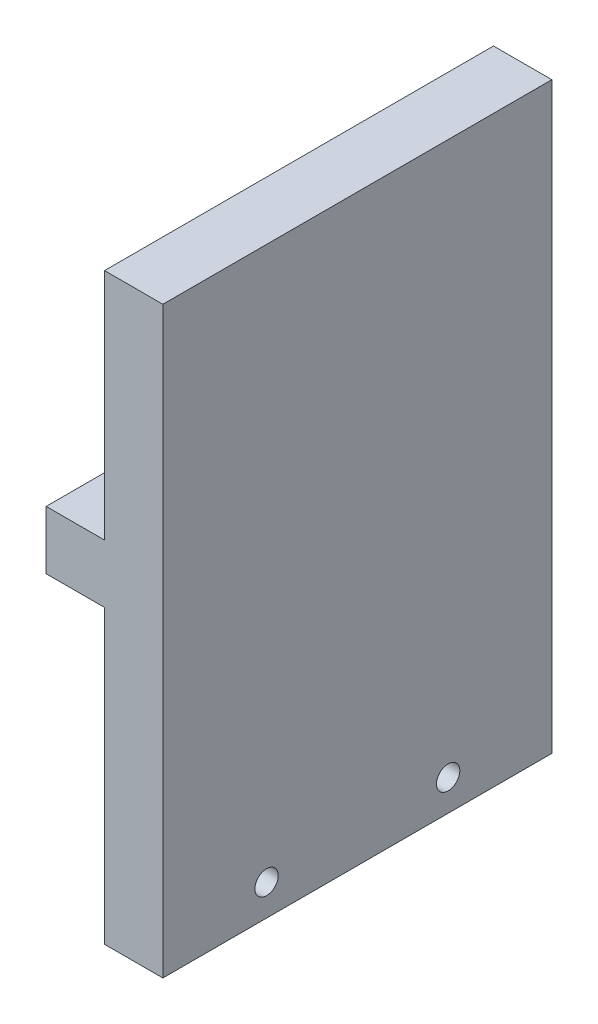
ISO-10303-21;
HEADER;
FILE_DESCRIPTION(('STEP AP214'),'2;1');
FILE_NAME('part.step','',(''),(''),'','','');
FILE_SCHEMA(('AUTOMOTIVE_DESIGN { 1 0 10303 214 1 1 1 1 }'));
ENDSEC;
DATA;
#1=APPLICATION_CONTEXT('core data for automotive mechanical design processes');
#2=APPLICATION_PROTOCOL_DEFINITION('international standard','automotive_design',2000,#1);
#3=PRODUCT_CONTEXT('',#1,'mechanical');
#4=PRODUCT('Part','Part','',(#3));
#5=PRODUCT_RELATED_PRODUCT_CATEGORY('part','',(#4));
#6=PRODUCT_DEFINITION_FORMATION('','',#4);
#7=PRODUCT_DEFINITION_CONTEXT('part definition',#1,'design');
#8=PRODUCT_DEFINITION('design','',#6,#7);
#9=PRODUCT_DEFINITION_SHAPE('','',#8);
#10=(LENGTH_UNIT() NAMED_UNIT(*) SI_UNIT(.MILLI.,.METRE.));
#11=(NAMED_UNIT(*) PLANE_ANGLE_UNIT() SI_UNIT($,.RADIAN.));
#12=(NAMED_UNIT(*) SI_UNIT($,.STERADIAN.) SOLID_ANGLE_UNIT());
#13=UNCERTAINTY_MEASURE_WITH_UNIT(LENGTH_MEASURE(1.E-05),#10,'distance_accuracy_value','');
#14=(GEOMETRIC_REPRESENTATION_CONTEXT(3) GLOBAL_UNCERTAINTY_ASSIGNED_CONTEXT((#13)) GLOBAL_UNIT_ASSIGNED_CONTEXT((#10,
#11,#12)) REPRESENTATION_CONTEXT('',''));
#15=CARTESIAN_POINT('',(0.,0.,0.));
#16=DIRECTION('',(0.,0.,1.));
#17=DIRECTION('',(1.,0.,0.));
#18=AXIS2_PLACEMENT_3D('',#15,#16,#17);
#19=CARTESIAN_POINT('',(0.,0.,0.));
#20=DIRECTION('',(-1.,0.,0.));
#21=DIRECTION('',(0.,0.,1.));
#22=AXIS2_PLACEMENT_3D('',#19,#20,#21);
#23=PLANE('',#22);
#24=CARTESIAN_POINT('',(0.,-67.,-23.345));
#25=DIRECTION('',(-1.,0.,0.));
#26=DIRECTION('',(0.,0.,1.));
#27=AXIS2_PLACEMENT_3D('',#24,#25,#26);
#28=CIRCLE('',#27,3.);
#29=CARTESIAN_POINT('',(0.,-67.,-20.345));
#30=VERTEX_POINT('',#29);
#31=EDGE_CURVE('E245',#30,#30,#28,.T.);
#32=ORIENTED_EDGE('',*,*,#31,.F.);
#33=EDGE_LOOP('',(#32));
#34=FACE_BOUND('',#33,.T.);
#35=CARTESIAN_POINT('',(0.,-67.,23.345));
#36=DIRECTION('',(-1.,0.,0.));
#37=DIRECTION('',(0.,0.,1.));
#38=AXIS2_PLACEMENT_3D('',#35,#36,#37);
#39=CIRCLE('',#38,3.);
#40=CARTESIAN_POINT('',(0.,-67.,26.345));
#41=VERTEX_POINT('',#40);
#42=EDGE_CURVE('E230',#41,#41,#39,.T.);
#43=ORIENTED_EDGE('',*,*,#42,.F.);
#44=EDGE_LOOP('',(#43));
#45=FACE_BOUND('',#44,.T.);
#46=DIRECTION('',(0.,1.,0.));
#47=VECTOR('',#46,1.);
#48=CARTESIAN_POINT('',(0.,0.,-15.));
#49=LINE('',#48,#47);
#50=CARTESIAN_POINT('',(0.,-15.,-15.));
#51=VERTEX_POINT('',#50);
#52=CARTESIAN_POINT('',(0.,0.,-15.));
#53=VERTEX_POINT('',#52);
#54=EDGE_CURVE('E229',#51,#53,#49,.T.);
#55=ORIENTED_EDGE('',*,*,#54,.F.);
#56=DIRECTION('',(0.,0.,1.));
#57=VECTOR('',#56,1.);
#58=CARTESIAN_POINT('',(0.,-15.,-50.));
#59=LINE('',#58,#57);
#60=CARTESIAN_POINT('',(0.,-15.,-50.));
#61=VERTEX_POINT('',#60);
#62=EDGE_CURVE('E227',#61,#51,#59,.T.);
#63=ORIENTED_EDGE('',*,*,#62,.F.);
#64=DIRECTION('',(0.,1.,0.));
#65=VECTOR('',#64,1.);
#66=CARTESIAN_POINT('',(0.,-75.,-50.));
#67=LINE('',#66,#65);
#68=CARTESIAN_POINT('',(0.,-75.,-50.));
#69=VERTEX_POINT('',#68);
#70=EDGE_CURVE('E147',#69,#61,#67,.T.);
#71=ORIENTED_EDGE('',*,*,#70,.F.);
#72=DIRECTION('',(0.,0.,-1.));
#73=VECTOR('',#72,1.);
#74=CARTESIAN_POINT('',(0.,-75.,50.));
#75=LINE('',#74,#73);
#76=CARTESIAN_POINT('',(0.,-75.,50.));
#77=VERTEX_POINT('',#76);
#78=EDGE_CURVE('E196',#77,#69,#75,.T.);
#79=ORIENTED_EDGE('',*,*,#78,.F.);
#80=DIRECTION('',(0.,-1.,0.));
#81=VECTOR('',#80,1.);
#82=CARTESIAN_POINT('',(0.,-75.,50.));
#83=LINE('',#82,#81);
#84=CARTESIAN_POINT('',(0.,0.,50.));
#85=VERTEX_POINT('',#84);
#86=EDGE_CURVE('E206',#85,#77,#83,.T.);
#87=ORIENTED_EDGE('',*,*,#86,.F.);
#88=DIRECTION('',(0.,0.,1.));
#89=VECTOR('',#88,1.);
#90=CARTESIAN_POINT('',(0.,0.,50.));
#91=LINE('',#90,#89);
#92=CARTESIAN_POINT('',(0.,0.,15.));
#93=VERTEX_POINT('',#92);
#94=EDGE_CURVE('E57',#93,#85,#91,.T.);
#95=ORIENTED_EDGE('',*,*,#94,.F.);
#96=DIRECTION('',(0.,-1.,0.));
#97=VECTOR('',#96,1.);
#98=CARTESIAN_POINT('',(0.,0.,15.));
#99=LINE('',#98,#97);
#100=CARTESIAN_POINT('',(0.,15.,15.));
#101=VERTEX_POINT('',#100);
#102=EDGE_CURVE('E151',#101,#93,#99,.T.);
#103=ORIENTED_EDGE('',*,*,#102,.F.);
#104=DIRECTION('',(0.,0.,-1.));
#105=VECTOR('',#104,1.);
#106=CARTESIAN_POINT('',(0.,15.,50.));
#107=LINE('',#106,#105);
#108=CARTESIAN_POINT('',(0.,15.,50.));
#109=VERTEX_POINT('',#108);
#110=EDGE_CURVE('E148',#109,#101,#107,.T.);
#111=ORIENTED_EDGE('',*,*,#110,.F.);
#112=CARTESIAN_POINT('',(0.,75.,50.));
#113=VERTEX_POINT('',#112);
#114=EDGE_CURVE('E213',#113,#109,#83,.T.);
#115=ORIENTED_EDGE('',*,*,#114,.F.);
#116=DIRECTION('',(0.,0.,1.));
#117=VECTOR('',#116,1.);
#118=CARTESIAN_POINT('',(0.,75.,50.));
#119=LINE('',#118,#117);
#120=CARTESIAN_POINT('',(0.,75.,-50.));
#121=VERTEX_POINT('',#120);
#122=EDGE_CURVE('E204',#121,#113,#119,.T.);
#123=ORIENTED_EDGE('',*,*,#122,.F.);
#124=CARTESIAN_POINT('',(0.,0.,-50.));
#125=VERTEX_POINT('',#124);
#126=EDGE_CURVE('E190',#125,#121,#67,.T.);
#127=ORIENTED_EDGE('',*,*,#126,.F.);
#128=DIRECTION('',(0.,0.,-1.));
#129=VECTOR('',#128,1.);
#130=CARTESIAN_POINT('',(0.,0.,-50.));
#131=LINE('',#130,#129);
#132=EDGE_CURVE('E142',#53,#125,#131,.T.);
#133=ORIENTED_EDGE('',*,*,#132,.F.);
#134=EDGE_LOOP('',(#55,#63,#71,#79,#87,#95,#103,#111,#115,#123,#127,#133));
#135=FACE_BOUND('',#134,.T.);
#136=ADVANCED_FACE('F32',(#34,#45,#135),#23,.T.);
#137=CARTESIAN_POINT('',(15.,-75.,-50.));
#138=DIRECTION('',(0.,0.,1.));
#139=DIRECTION('',(1.,0.,0.));
#140=AXIS2_PLACEMENT_3D('',#137,#138,#139);
#141=PLANE('',#140);
#142=ORIENTED_EDGE('',*,*,#70,.T.);
#143=DIRECTION('',(1.,0.,0.));
#144=VECTOR('',#143,1.);
#145=CARTESIAN_POINT('',(-15.,-15.,-50.));
#146=LINE('',#145,#144);
#147=CARTESIAN_POINT('',(-15.,-15.,-50.));
#148=VERTEX_POINT('',#147);
#149=EDGE_CURVE('E127',#148,#61,#146,.T.);
#150=ORIENTED_EDGE('',*,*,#149,.F.);
#151=DIRECTION('',(0.,-1.,0.));
#152=VECTOR('',#151,1.);
#153=CARTESIAN_POINT('',(-15.,0.,-50.));
#154=LINE('',#153,#152);
#155=CARTESIAN_POINT('',(-15.,0.,-50.));
#156=VERTEX_POINT('',#155);
#157=EDGE_CURVE('E134',#156,#148,#154,.T.);
#158=ORIENTED_EDGE('',*,*,#157,.F.);
#159=DIRECTION('',(1.,0.,0.));
#160=VECTOR('',#159,1.);
#161=CARTESIAN_POINT('',(-15.,0.,-50.));
#162=LINE('',#161,#160);
#163=EDGE_CURVE('E240',#156,#125,#162,.T.);
#164=ORIENTED_EDGE('',*,*,#163,.T.);
#165=ORIENTED_EDGE('',*,*,#126,.T.);
#166=DIRECTION('',(-1.,0.,0.));
#167=VECTOR('',#166,1.);
#168=CARTESIAN_POINT('',(15.,75.,-50.));
#169=LINE('',#168,#167);
#170=CARTESIAN_POINT('',(15.,75.,-50.));
#171=VERTEX_POINT('',#170);
#172=EDGE_CURVE('E11',#171,#121,#169,.T.);
#173=ORIENTED_EDGE('',*,*,#172,.F.);
#174=DIRECTION('',(0.,1.,0.));
#175=VECTOR('',#174,1.);
#176=CARTESIAN_POINT('',(15.,-75.,-50.));
#177=LINE('',#176,#175);
#178=CARTESIAN_POINT('',(15.,-75.,-50.));
#179=VERTEX_POINT('',#178);
#180=EDGE_CURVE('E192',#179,#171,#177,.T.);
#181=ORIENTED_EDGE('',*,*,#180,.F.);
#182=DIRECTION('',(-1.,0.,0.));
#183=VECTOR('',#182,1.);
#184=CARTESIAN_POINT('',(15.,-75.,-50.));
#185=LINE('',#184,#183);
#186=EDGE_CURVE('E202',#179,#69,#185,.T.);
#187=ORIENTED_EDGE('',*,*,#186,.T.);
#188=EDGE_LOOP('',(#142,#150,#158,#164,#165,#173,#181,#187));
#189=FACE_BOUND('',#188,.T.);
#190=ADVANCED_FACE('F34',(#189),#141,.F.);
#191=CARTESIAN_POINT('',(15.,75.,50.));
#192=DIRECTION('',(0.,-1.,0.));
#193=DIRECTION('',(0.,0.,-1.));
#194=AXIS2_PLACEMENT_3D('',#191,#192,#193);
#195=PLANE('',#194);
#196=ORIENTED_EDGE('',*,*,#122,.T.);
#197=DIRECTION('',(-1.,0.,0.));
#198=VECTOR('',#197,1.);
#199=CARTESIAN_POINT('',(15.,75.,50.));
#200=LINE('',#199,#198);
#201=CARTESIAN_POINT('',(15.,75.,50.));
#202=VERTEX_POINT('',#201);
#203=EDGE_CURVE('E41',#202,#113,#200,.T.);
#204=ORIENTED_EDGE('',*,*,#203,.F.);
#205=DIRECTION('',(0.,0.,1.));
#206=VECTOR('',#205,1.);
#207=CARTESIAN_POINT('',(15.,75.,50.));
#208=LINE('',#207,#206);
#209=EDGE_CURVE('E195',#171,#202,#208,.T.);
#210=ORIENTED_EDGE('',*,*,#209,.F.);
#211=ORIENTED_EDGE('',*,*,#172,.T.);
#212=EDGE_LOOP('',(#196,#204,#210,#211));
#213=FACE_BOUND('',#212,.T.);
#214=ADVANCED_FACE('F265',(#213),#195,.F.);
#215=CARTESIAN_POINT('',(15.,-75.,50.));
#216=DIRECTION('',(0.,0.,-1.));
#217=DIRECTION('',(-1.,0.,0.));
#218=AXIS2_PLACEMENT_3D('',#215,#216,#217);
#219=PLANE('',#218);
#220=ORIENTED_EDGE('',*,*,#114,.T.);
#221=DIRECTION('',(1.,0.,0.));
#222=VECTOR('',#221,1.);
#223=CARTESIAN_POINT('',(-15.,15.,50.));
#224=LINE('',#223,#222);
#225=CARTESIAN_POINT('',(-15.,15.,50.));
#226=VERTEX_POINT('',#225);
#227=EDGE_CURVE('E185',#226,#109,#224,.T.);
#228=ORIENTED_EDGE('',*,*,#227,.F.);
#229=DIRECTION('',(0.,1.,0.));
#230=VECTOR('',#229,1.);
#231=CARTESIAN_POINT('',(-15.,0.,50.));
#232=LINE('',#231,#230);
#233=CARTESIAN_POINT('',(-15.,0.,50.));
#234=VERTEX_POINT('',#233);
#235=EDGE_CURVE('E156',#234,#226,#232,.T.);
#236=ORIENTED_EDGE('',*,*,#235,.F.);
#237=DIRECTION('',(1.,0.,0.));
#238=VECTOR('',#237,1.);
#239=CARTESIAN_POINT('',(-15.,0.,50.));
#240=LINE('',#239,#238);
#241=EDGE_CURVE('E165',#234,#85,#240,.T.);
#242=ORIENTED_EDGE('',*,*,#241,.T.);
#243=ORIENTED_EDGE('',*,*,#86,.T.);
#244=DIRECTION('',(-1.,0.,0.));
#245=VECTOR('',#244,1.);
#246=CARTESIAN_POINT('',(15.,-75.,50.));
#247=LINE('',#246,#245);
#248=CARTESIAN_POINT('',(15.,-75.,50.));
#249=VERTEX_POINT('',#248);
#250=EDGE_CURVE('E218',#249,#77,#247,.T.);
#251=ORIENTED_EDGE('',*,*,#250,.F.);
#252=DIRECTION('',(0.,-1.,0.));
#253=VECTOR('',#252,1.);
#254=CARTESIAN_POINT('',(15.,-75.,50.));
#255=LINE('',#254,#253);
#256=EDGE_CURVE('E198',#202,#249,#255,.T.);
#257=ORIENTED_EDGE('',*,*,#256,.F.);
#258=ORIENTED_EDGE('',*,*,#203,.T.);
#259=EDGE_LOOP('',(#220,#228,#236,#242,#243,#251,#257,#258));
#260=FACE_BOUND('',#259,.T.);
#261=ADVANCED_FACE('F269',(#260),#219,.F.);
#262=CARTESIAN_POINT('',(15.,-75.,50.));
#263=DIRECTION('',(0.,1.,0.));
#264=DIRECTION('',(0.,0.,1.));
#265=AXIS2_PLACEMENT_3D('',#262,#263,#264);
#266=PLANE('',#265);
#267=ORIENTED_EDGE('',*,*,#78,.T.);
#268=ORIENTED_EDGE('',*,*,#186,.F.);
#269=DIRECTION('',(0.,0.,-1.));
#270=VECTOR('',#269,1.);
#271=CARTESIAN_POINT('',(15.,-75.,50.));
#272=LINE('',#271,#270);
#273=EDGE_CURVE('E200',#249,#179,#272,.T.);
#274=ORIENTED_EDGE('',*,*,#273,.F.);
#275=ORIENTED_EDGE('',*,*,#250,.T.);
#276=EDGE_LOOP('',(#267,#268,#274,#275));
#277=FACE_BOUND('',#276,.T.);
#278=ADVANCED_FACE('F258',(#277),#266,.F.);
#279=CARTESIAN_POINT('',(15.,0.,0.));
#280=DIRECTION('',(-1.,0.,0.));
#281=DIRECTION('',(0.,0.,1.));
#282=AXIS2_PLACEMENT_3D('',#279,#280,#281);
#283=PLANE('',#282);
#284=CARTESIAN_POINT('',(15.,-67.,-23.345));
#285=DIRECTION('',(1.,0.,0.));
#286=DIRECTION('',(0.,0.,-1.));
#287=AXIS2_PLACEMENT_3D('',#284,#285,#286);
#288=CIRCLE('',#287,3.);
#289=CARTESIAN_POINT('',(15.,-67.,-26.345));
#290=VERTEX_POINT('',#289);
#291=EDGE_CURVE('E248',#290,#290,#288,.T.);
#292=ORIENTED_EDGE('',*,*,#291,.F.);
#293=EDGE_LOOP('',(#292));
#294=FACE_BOUND('',#293,.T.);
#295=CARTESIAN_POINT('',(15.,-67.,23.345));
#296=DIRECTION('',(1.,0.,0.));
#297=DIRECTION('',(0.,0.,-1.));
#298=AXIS2_PLACEMENT_3D('',#295,#296,#297);
#299=CIRCLE('',#298,3.);
#300=CARTESIAN_POINT('',(15.,-67.,20.345));
#301=VERTEX_POINT('',#300);
#302=EDGE_CURVE('E234',#301,#301,#299,.T.);
#303=ORIENTED_EDGE('',*,*,#302,.F.);
#304=EDGE_LOOP('',(#303));
#305=FACE_BOUND('',#304,.T.);
#306=ORIENTED_EDGE('',*,*,#180,.T.);
#307=ORIENTED_EDGE('',*,*,#209,.T.);
#308=ORIENTED_EDGE('',*,*,#256,.T.);
#309=ORIENTED_EDGE('',*,*,#273,.T.);
#310=EDGE_LOOP('',(#306,#307,#308,#309));
#311=FACE_BOUND('',#310,.T.);
#312=ADVANCED_FACE('F254',(#294,#305,#311),#283,.F.);
#313=CARTESIAN_POINT('',(-15.,15.,50.));
#314=DIRECTION('',(0.,-1.,0.));
#315=DIRECTION('',(0.,0.,-1.));
#316=AXIS2_PLACEMENT_3D('',#313,#314,#315);
#317=PLANE('',#316);
#318=ORIENTED_EDGE('',*,*,#110,.T.);
#319=DIRECTION('',(1.,0.,0.));
#320=VECTOR('',#319,1.);
#321=CARTESIAN_POINT('',(-15.,15.,15.));
#322=LINE('',#321,#320);
#323=CARTESIAN_POINT('',(-15.,15.,15.));
#324=VERTEX_POINT('',#323);
#325=EDGE_CURVE('E180',#324,#101,#322,.T.);
#326=ORIENTED_EDGE('',*,*,#325,.F.);
#327=DIRECTION('',(0.,0.,-1.));
#328=VECTOR('',#327,1.);
#329=CARTESIAN_POINT('',(-15.,15.,50.));
#330=LINE('',#329,#328);
#331=EDGE_CURVE('E159',#226,#324,#330,.T.);
#332=ORIENTED_EDGE('',*,*,#331,.F.);
#333=ORIENTED_EDGE('',*,*,#227,.T.);
#334=EDGE_LOOP('',(#318,#326,#332,#333));
#335=FACE_BOUND('',#334,.T.);
#336=ADVANCED_FACE('F257',(#335),#317,.F.);
#337=CARTESIAN_POINT('',(-15.,0.,15.));
#338=DIRECTION('',(0.,0.,1.));
#339=DIRECTION('',(1.,0.,0.));
#340=AXIS2_PLACEMENT_3D('',#337,#338,#339);
#341=PLANE('',#340);
#342=ORIENTED_EDGE('',*,*,#102,.T.);
#343=DIRECTION('',(1.,0.,0.));
#344=VECTOR('',#343,1.);
#345=CARTESIAN_POINT('',(-15.,0.,15.));
#346=LINE('',#345,#344);
#347=CARTESIAN_POINT('',(-15.,0.,15.));
#348=VERTEX_POINT('',#347);
#349=EDGE_CURVE('E169',#348,#93,#346,.T.);
#350=ORIENTED_EDGE('',*,*,#349,.F.);
#351=DIRECTION('',(0.,-1.,0.));
#352=VECTOR('',#351,1.);
#353=CARTESIAN_POINT('',(-15.,0.,15.));
#354=LINE('',#353,#352);
#355=EDGE_CURVE('E161',#324,#348,#354,.T.);
#356=ORIENTED_EDGE('',*,*,#355,.F.);
#357=ORIENTED_EDGE('',*,*,#325,.T.);
#358=EDGE_LOOP('',(#342,#350,#356,#357));
#359=FACE_BOUND('',#358,.T.);
#360=ADVANCED_FACE('F289',(#359),#341,.F.);
#361=CARTESIAN_POINT('',(-15.,0.,50.));
#362=DIRECTION('',(0.,1.,0.));
#363=DIRECTION('',(0.,0.,1.));
#364=AXIS2_PLACEMENT_3D('',#361,#362,#363);
#365=PLANE('',#364);
#366=ORIENTED_EDGE('',*,*,#94,.T.);
#367=ORIENTED_EDGE('',*,*,#241,.F.);
#368=DIRECTION('',(0.,0.,1.));
#369=VECTOR('',#368,1.);
#370=CARTESIAN_POINT('',(-15.,0.,50.));
#371=LINE('',#370,#369);
#372=EDGE_CURVE('E163',#348,#234,#371,.T.);
#373=ORIENTED_EDGE('',*,*,#372,.F.);
#374=ORIENTED_EDGE('',*,*,#349,.T.);
#375=EDGE_LOOP('',(#366,#367,#373,#374));
#376=FACE_BOUND('',#375,.T.);
#377=ADVANCED_FACE('F293',(#376),#365,.F.);
#378=CARTESIAN_POINT('',(-15.,0.,0.));
#379=DIRECTION('',(-1.,0.,0.));
#380=DIRECTION('',(0.,0.,1.));
#381=AXIS2_PLACEMENT_3D('',#378,#379,#380);
#382=PLANE('',#381);
#383=ORIENTED_EDGE('',*,*,#235,.T.);
#384=ORIENTED_EDGE('',*,*,#331,.T.);
#385=ORIENTED_EDGE('',*,*,#355,.T.);
#386=ORIENTED_EDGE('',*,*,#372,.T.);
#387=EDGE_LOOP('',(#383,#384,#385,#386));
#388=FACE_BOUND('',#387,.T.);
#389=ADVANCED_FACE('F296',(#388),#382,.T.);
#390=CARTESIAN_POINT('',(-15.,-15.,-50.));
#391=DIRECTION('',(0.,1.,0.));
#392=DIRECTION('',(0.,0.,1.));
#393=AXIS2_PLACEMENT_3D('',#390,#391,#392);
#394=PLANE('',#393);
#395=ORIENTED_EDGE('',*,*,#62,.T.);
#396=DIRECTION('',(1.,0.,0.));
#397=VECTOR('',#396,1.);
#398=CARTESIAN_POINT('',(-15.,-15.,-15.));
#399=LINE('',#398,#397);
#400=CARTESIAN_POINT('',(-15.,-15.,-15.));
#401=VERTEX_POINT('',#400);
#402=EDGE_CURVE('E130',#401,#51,#399,.T.);
#403=ORIENTED_EDGE('',*,*,#402,.F.);
#404=DIRECTION('',(0.,0.,1.));
#405=VECTOR('',#404,1.);
#406=CARTESIAN_POINT('',(-15.,-15.,-50.));
#407=LINE('',#406,#405);
#408=EDGE_CURVE('E123',#148,#401,#407,.T.);
#409=ORIENTED_EDGE('',*,*,#408,.F.);
#410=ORIENTED_EDGE('',*,*,#149,.T.);
#411=EDGE_LOOP('',(#395,#403,#409,#410));
#412=FACE_BOUND('',#411,.T.);
#413=ADVANCED_FACE('F125',(#412),#394,.F.);
#414=CARTESIAN_POINT('',(-15.,0.,-15.));
#415=DIRECTION('',(0.,0.,-1.));
#416=DIRECTION('',(0.,1.,0.));
#417=AXIS2_PLACEMENT_3D('',#414,#415,#416);
#418=PLANE('',#417);
#419=ORIENTED_EDGE('',*,*,#54,.T.);
#420=DIRECTION('',(1.,0.,0.));
#421=VECTOR('',#420,1.);
#422=CARTESIAN_POINT('',(-15.,0.,-15.));
#423=LINE('',#422,#421);
#424=CARTESIAN_POINT('',(-15.,0.,-15.));
#425=VERTEX_POINT('',#424);
#426=EDGE_CURVE('E49',#425,#53,#423,.T.);
#427=ORIENTED_EDGE('',*,*,#426,.F.);
#428=DIRECTION('',(0.,1.,0.));
#429=VECTOR('',#428,1.);
#430=CARTESIAN_POINT('',(-15.,0.,-15.));
#431=LINE('',#430,#429);
#432=EDGE_CURVE('E133',#401,#425,#431,.T.);
#433=ORIENTED_EDGE('',*,*,#432,.F.);
#434=ORIENTED_EDGE('',*,*,#402,.T.);
#435=EDGE_LOOP('',(#419,#427,#433,#434));
#436=FACE_BOUND('',#435,.T.);
#437=ADVANCED_FACE('F302',(#436),#418,.F.);
#438=CARTESIAN_POINT('',(-15.,0.,-50.));
#439=DIRECTION('',(0.,-1.,0.));
#440=DIRECTION('',(0.,0.,-1.));
#441=AXIS2_PLACEMENT_3D('',#438,#439,#440);
#442=PLANE('',#441);
#443=ORIENTED_EDGE('',*,*,#132,.T.);
#444=ORIENTED_EDGE('',*,*,#163,.F.);
#445=DIRECTION('',(0.,0.,-1.));
#446=VECTOR('',#445,1.);
#447=CARTESIAN_POINT('',(-15.,0.,-50.));
#448=LINE('',#447,#446);
#449=EDGE_CURVE('E138',#425,#156,#448,.T.);
#450=ORIENTED_EDGE('',*,*,#449,.F.);
#451=ORIENTED_EDGE('',*,*,#426,.T.);
#452=EDGE_LOOP('',(#443,#444,#450,#451));
#453=FACE_BOUND('',#452,.T.);
#454=ADVANCED_FACE('F305',(#453),#442,.F.);
#455=CARTESIAN_POINT('',(-15.,0.,0.));
#456=DIRECTION('',(-1.,0.,0.));
#457=DIRECTION('',(0.,0.,1.));
#458=AXIS2_PLACEMENT_3D('',#455,#456,#457);
#459=PLANE('',#458);
#460=ORIENTED_EDGE('',*,*,#157,.T.);
#461=ORIENTED_EDGE('',*,*,#408,.T.);
#462=ORIENTED_EDGE('',*,*,#432,.T.);
#463=ORIENTED_EDGE('',*,*,#449,.T.);
#464=EDGE_LOOP('',(#460,#461,#462,#463));
#465=FACE_BOUND('',#464,.T.);
#466=ADVANCED_FACE('F137',(#465),#459,.T.);
#467=CARTESIAN_POINT('',(-15.000025,-67.,23.345));
#468=DIRECTION('',(1.,0.,0.));
#469=DIRECTION('',(0.,0.,-1.));
#470=AXIS2_PLACEMENT_3D('',#467,#468,#469);
#471=CYLINDRICAL_SURFACE('',#470,3.);
#472=ORIENTED_EDGE('',*,*,#42,.T.);
#473=EDGE_LOOP('',(#472));
#474=FACE_BOUND('',#473,.T.);
#475=ORIENTED_EDGE('',*,*,#302,.T.);
#476=EDGE_LOOP('',(#475));
#477=FACE_BOUND('',#476,.T.);
#478=ADVANCED_FACE('F311',(#474,#477),#471,.F.);
#479=CARTESIAN_POINT('',(-15.000025,-67.,-23.345));
#480=DIRECTION('',(1.,0.,0.));
#481=DIRECTION('',(0.,0.,-1.));
#482=AXIS2_PLACEMENT_3D('',#479,#480,#481);
#483=CYLINDRICAL_SURFACE('',#482,3.);
#484=ORIENTED_EDGE('',*,*,#31,.T.);
#485=EDGE_LOOP('',(#484));
#486=FACE_BOUND('',#485,.T.);
#487=ORIENTED_EDGE('',*,*,#291,.T.);
#488=EDGE_LOOP('',(#487));
#489=FACE_BOUND('',#488,.T.);
#490=ADVANCED_FACE('F252',(#486,#489),#483,.F.);
#491=CLOSED_SHELL('',(#136,#190,#214,#261,#278,#312,#336,#360,#377,#389,#413,#437,#454,#466,
#478,#490));
#492=MANIFOLD_SOLID_BREP('B2',#491);
#493=ADVANCED_BREP_SHAPE_REPRESENTATION('',(#18,#492),#14);
#494=SHAPE_DEFINITION_REPRESENTATION(#9,#493);
ENDSEC;
END-ISO-10303-21;
